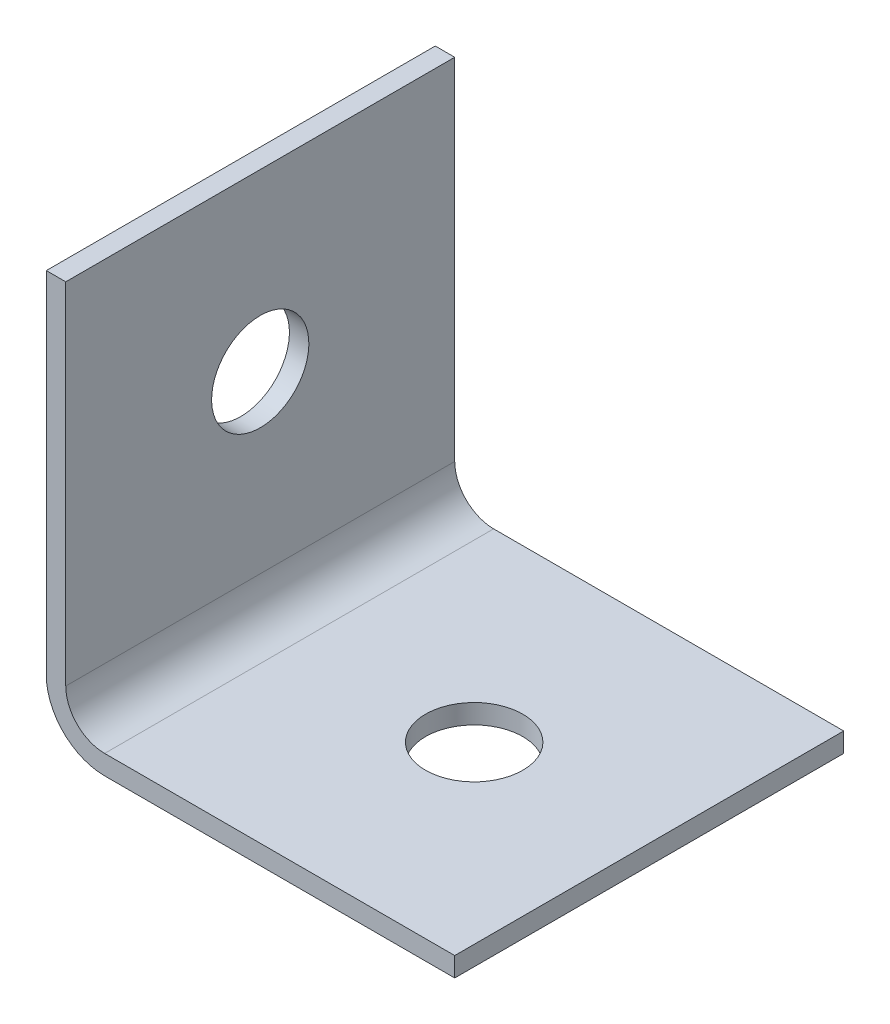
ISO-10303-21;
HEADER;
FILE_DESCRIPTION(('STEP AP214'),'2;1');
FILE_NAME('part.step','',(''),(''),'','','');
FILE_SCHEMA(('AUTOMOTIVE_DESIGN { 1 0 10303 214 1 1 1 1 }'));
ENDSEC;
DATA;
#1=APPLICATION_CONTEXT('core data for automotive mechanical design processes');
#2=APPLICATION_PROTOCOL_DEFINITION('international standard','automotive_design',2000,#1);
#3=PRODUCT_CONTEXT('',#1,'mechanical');
#4=PRODUCT('Part','Part','',(#3));
#5=PRODUCT_RELATED_PRODUCT_CATEGORY('part','',(#4));
#6=PRODUCT_DEFINITION_FORMATION('','',#4);
#7=PRODUCT_DEFINITION_CONTEXT('part definition',#1,'design');
#8=PRODUCT_DEFINITION('design','',#6,#7);
#9=PRODUCT_DEFINITION_SHAPE('','',#8);
#10=(LENGTH_UNIT() NAMED_UNIT(*) SI_UNIT(.MILLI.,.METRE.));
#11=(NAMED_UNIT(*) PLANE_ANGLE_UNIT() SI_UNIT($,.RADIAN.));
#12=(NAMED_UNIT(*) SI_UNIT($,.STERADIAN.) SOLID_ANGLE_UNIT());
#13=UNCERTAINTY_MEASURE_WITH_UNIT(LENGTH_MEASURE(1.E-05),#10,'distance_accuracy_value','');
#14=(GEOMETRIC_REPRESENTATION_CONTEXT(3) GLOBAL_UNCERTAINTY_ASSIGNED_CONTEXT((#13)) GLOBAL_UNIT_ASSIGNED_CONTEXT((#10,
#11,#12)) REPRESENTATION_CONTEXT('',''));
#15=CARTESIAN_POINT('',(0.,0.,0.));
#16=DIRECTION('',(0.,0.,1.));
#17=DIRECTION('',(1.,0.,0.));
#18=AXIS2_PLACEMENT_3D('',#15,#16,#17);
#19=CARTESIAN_POINT('',(0.,-21.,20.));
#20=DIRECTION('',(0.,1.,0.));
#21=DIRECTION('',(0.,0.,1.));
#22=AXIS2_PLACEMENT_3D('',#19,#20,#21);
#23=PLANE('',#22);
#24=CARTESIAN_POINT('',(11.,-21.,10.));
#25=DIRECTION('',(0.,1.,0.));
#26=DIRECTION('',(0.,0.,1.));
#27=AXIS2_PLACEMENT_3D('',#24,#25,#26);
#28=CIRCLE('',#27,2.5);
#29=CARTESIAN_POINT('',(11.,-21.,12.5));
#30=VERTEX_POINT('',#29);
#31=EDGE_CURVE('E223',#30,#30,#28,.T.);
#32=ORIENTED_EDGE('',*,*,#31,.T.);
#33=EDGE_LOOP('',(#32));
#34=FACE_BOUND('',#33,.T.);
#35=DIRECTION('',(1.,0.,0.));
#36=VECTOR('',#35,1.);
#37=CARTESIAN_POINT('',(0.,-21.,20.));
#38=LINE('',#37,#36);
#39=CARTESIAN_POINT('',(2.,-21.,20.));
#40=VERTEX_POINT('',#39);
#41=CARTESIAN_POINT('',(20.,-21.,20.));
#42=VERTEX_POINT('',#41);
#43=EDGE_CURVE('E97',#40,#42,#38,.T.);
#44=ORIENTED_EDGE('',*,*,#43,.F.);
#45=DIRECTION('',(0.,0.,-1.));
#46=VECTOR('',#45,1.);
#47=CARTESIAN_POINT('',(2.,-21.,20.));
#48=LINE('',#47,#46);
#49=CARTESIAN_POINT('',(2.,-21.,0.));
#50=VERTEX_POINT('',#49);
#51=EDGE_CURVE('E117',#40,#50,#48,.T.);
#52=ORIENTED_EDGE('',*,*,#51,.T.);
#53=DIRECTION('',(1.,0.,0.));
#54=VECTOR('',#53,1.);
#55=CARTESIAN_POINT('',(0.,-21.,0.));
#56=LINE('',#55,#54);
#57=CARTESIAN_POINT('',(20.,-21.,0.));
#58=VERTEX_POINT('',#57);
#59=EDGE_CURVE('E113',#50,#58,#56,.T.);
#60=ORIENTED_EDGE('',*,*,#59,.T.);
#61=DIRECTION('',(0.,0.,-1.));
#62=VECTOR('',#61,1.);
#63=CARTESIAN_POINT('',(20.,-21.,20.));
#64=LINE('',#63,#62);
#65=EDGE_CURVE('E111',#42,#58,#64,.T.);
#66=ORIENTED_EDGE('',*,*,#65,.F.);
#67=EDGE_LOOP('',(#44,#52,#60,#66));
#68=FACE_BOUND('',#67,.T.);
#69=ADVANCED_FACE('F33',(#34,#68),#23,.F.);
#70=CARTESIAN_POINT('',(20.,-20.,20.));
#71=DIRECTION('',(1.,0.,0.));
#72=DIRECTION('',(0.,0.,-1.));
#73=AXIS2_PLACEMENT_3D('',#70,#71,#72);
#74=PLANE('',#73);
#75=DIRECTION('',(0.,-1.,0.));
#76=VECTOR('',#75,1.);
#77=CARTESIAN_POINT('',(20.,-20.,0.));
#78=LINE('',#77,#76);
#79=CARTESIAN_POINT('',(20.,-20.,0.));
#80=VERTEX_POINT('',#79);
#81=EDGE_CURVE('E138',#80,#58,#78,.T.);
#82=ORIENTED_EDGE('',*,*,#81,.F.);
#83=DIRECTION('',(0.,0.,-1.));
#84=VECTOR('',#83,1.);
#85=CARTESIAN_POINT('',(20.,-20.,20.));
#86=LINE('',#85,#84);
#87=CARTESIAN_POINT('',(20.,-20.,20.));
#88=VERTEX_POINT('',#87);
#89=EDGE_CURVE('E118',#88,#80,#86,.T.);
#90=ORIENTED_EDGE('',*,*,#89,.F.);
#91=DIRECTION('',(0.,-1.,0.));
#92=VECTOR('',#91,1.);
#93=CARTESIAN_POINT('',(20.,-20.,20.));
#94=LINE('',#93,#92);
#95=EDGE_CURVE('E102',#88,#42,#94,.T.);
#96=ORIENTED_EDGE('',*,*,#95,.T.);
#97=ORIENTED_EDGE('',*,*,#65,.T.);
#98=EDGE_LOOP('',(#82,#90,#96,#97));
#99=FACE_BOUND('',#98,.T.);
#100=ADVANCED_FACE('F121',(#99),#74,.T.);
#101=CARTESIAN_POINT('',(0.,-20.,20.));
#102=DIRECTION('',(0.,1.,0.));
#103=DIRECTION('',(0.,0.,1.));
#104=AXIS2_PLACEMENT_3D('',#101,#102,#103);
#105=PLANE('',#104);
#106=CARTESIAN_POINT('',(11.,-20.,10.));
#107=DIRECTION('',(0.,1.,0.));
#108=DIRECTION('',(0.,0.,1.));
#109=AXIS2_PLACEMENT_3D('',#106,#107,#108);
#110=CIRCLE('',#109,2.5);
#111=CARTESIAN_POINT('',(11.,-20.,12.5));
#112=VERTEX_POINT('',#111);
#113=EDGE_CURVE('E221',#112,#112,#110,.T.);
#114=ORIENTED_EDGE('',*,*,#113,.F.);
#115=EDGE_LOOP('',(#114));
#116=FACE_BOUND('',#115,.T.);
#117=DIRECTION('',(1.,0.,0.));
#118=VECTOR('',#117,1.);
#119=CARTESIAN_POINT('',(0.,-20.,0.));
#120=LINE('',#119,#118);
#121=CARTESIAN_POINT('',(2.,-20.,0.));
#122=VERTEX_POINT('',#121);
#123=EDGE_CURVE('E140',#122,#80,#120,.T.);
#124=ORIENTED_EDGE('',*,*,#123,.F.);
#125=DIRECTION('',(0.,0.,-1.));
#126=VECTOR('',#125,1.);
#127=CARTESIAN_POINT('',(2.,-20.,20.));
#128=LINE('',#127,#126);
#129=CARTESIAN_POINT('',(2.,-20.,20.));
#130=VERTEX_POINT('',#129);
#131=EDGE_CURVE('E49',#122,#130,#128,.F.);
#132=ORIENTED_EDGE('',*,*,#131,.T.);
#133=DIRECTION('',(1.,0.,0.));
#134=VECTOR('',#133,1.);
#135=CARTESIAN_POINT('',(0.,-20.,20.));
#136=LINE('',#135,#134);
#137=EDGE_CURVE('E123',#130,#88,#136,.T.);
#138=ORIENTED_EDGE('',*,*,#137,.T.);
#139=ORIENTED_EDGE('',*,*,#89,.T.);
#140=EDGE_LOOP('',(#124,#132,#138,#139));
#141=FACE_BOUND('',#140,.T.);
#142=ADVANCED_FACE('F194',(#116,#141),#105,.T.);
#143=CARTESIAN_POINT('',(0.,0.,20.));
#144=DIRECTION('',(1.,0.,0.));
#145=DIRECTION('',(0.,1.,0.));
#146=AXIS2_PLACEMENT_3D('',#143,#144,#145);
#147=PLANE('',#146);
#148=CARTESIAN_POINT('',(0.,-9.,10.));
#149=DIRECTION('',(1.,0.,0.));
#150=DIRECTION('',(0.,1.,0.));
#151=AXIS2_PLACEMENT_3D('',#148,#149,#150);
#152=CIRCLE('',#151,2.5);
#153=CARTESIAN_POINT('',(0.,-6.5,10.));
#154=VERTEX_POINT('',#153);
#155=EDGE_CURVE('E224',#154,#154,#152,.T.);
#156=ORIENTED_EDGE('',*,*,#155,.F.);
#157=EDGE_LOOP('',(#156));
#158=FACE_BOUND('',#157,.T.);
#159=DIRECTION('',(0.,-1.,0.));
#160=VECTOR('',#159,1.);
#161=CARTESIAN_POINT('',(0.,0.,20.));
#162=LINE('',#161,#160);
#163=CARTESIAN_POINT('',(0.,0.,20.));
#164=VERTEX_POINT('',#163);
#165=CARTESIAN_POINT('',(0.,-18.,20.));
#166=VERTEX_POINT('',#165);
#167=EDGE_CURVE('E125',#164,#166,#162,.T.);
#168=ORIENTED_EDGE('',*,*,#167,.T.);
#169=DIRECTION('',(0.,0.,-1.));
#170=VECTOR('',#169,1.);
#171=CARTESIAN_POINT('',(0.,-18.,0.));
#172=LINE('',#171,#170);
#173=CARTESIAN_POINT('',(0.,-18.,0.));
#174=VERTEX_POINT('',#173);
#175=EDGE_CURVE('E159',#166,#174,#172,.T.);
#176=ORIENTED_EDGE('',*,*,#175,.T.);
#177=DIRECTION('',(0.,-1.,0.));
#178=VECTOR('',#177,1.);
#179=CARTESIAN_POINT('',(0.,0.,0.));
#180=LINE('',#179,#178);
#181=CARTESIAN_POINT('',(0.,0.,0.));
#182=VERTEX_POINT('',#181);
#183=EDGE_CURVE('E142',#182,#174,#180,.T.);
#184=ORIENTED_EDGE('',*,*,#183,.F.);
#185=DIRECTION('',(0.,0.,-1.));
#186=VECTOR('',#185,1.);
#187=CARTESIAN_POINT('',(0.,0.,20.));
#188=LINE('',#187,#186);
#189=EDGE_CURVE('E150',#164,#182,#188,.T.);
#190=ORIENTED_EDGE('',*,*,#189,.F.);
#191=EDGE_LOOP('',(#168,#176,#184,#190));
#192=FACE_BOUND('',#191,.T.);
#193=ADVANCED_FACE('F166',(#158,#192),#147,.T.);
#194=CARTESIAN_POINT('',(-1.,0.,20.));
#195=DIRECTION('',(0.,1.,0.));
#196=DIRECTION('',(-1.,0.,0.));
#197=AXIS2_PLACEMENT_3D('',#194,#195,#196);
#198=PLANE('',#197);
#199=DIRECTION('',(1.,0.,0.));
#200=VECTOR('',#199,1.);
#201=CARTESIAN_POINT('',(-1.,0.,0.));
#202=LINE('',#201,#200);
#203=CARTESIAN_POINT('',(-1.,0.,0.));
#204=VERTEX_POINT('',#203);
#205=EDGE_CURVE('E144',#204,#182,#202,.T.);
#206=ORIENTED_EDGE('',*,*,#205,.F.);
#207=DIRECTION('',(0.,0.,-1.));
#208=VECTOR('',#207,1.);
#209=CARTESIAN_POINT('',(-1.,0.,20.));
#210=LINE('',#209,#208);
#211=CARTESIAN_POINT('',(-1.,0.,20.));
#212=VERTEX_POINT('',#211);
#213=EDGE_CURVE('E136',#212,#204,#210,.T.);
#214=ORIENTED_EDGE('',*,*,#213,.F.);
#215=DIRECTION('',(1.,0.,0.));
#216=VECTOR('',#215,1.);
#217=CARTESIAN_POINT('',(-1.,0.,20.));
#218=LINE('',#217,#216);
#219=EDGE_CURVE('E131',#212,#164,#218,.T.);
#220=ORIENTED_EDGE('',*,*,#219,.T.);
#221=ORIENTED_EDGE('',*,*,#189,.T.);
#222=EDGE_LOOP('',(#206,#214,#220,#221));
#223=FACE_BOUND('',#222,.T.);
#224=ADVANCED_FACE('F174',(#223),#198,.T.);
#225=CARTESIAN_POINT('',(-1.,0.,20.));
#226=DIRECTION('',(1.,0.,0.));
#227=DIRECTION('',(0.,1.,0.));
#228=AXIS2_PLACEMENT_3D('',#225,#226,#227);
#229=PLANE('',#228);
#230=CARTESIAN_POINT('',(-0.999999999999999,-9.,10.));
#231=DIRECTION('',(1.,0.,0.));
#232=DIRECTION('',(0.,1.,0.));
#233=AXIS2_PLACEMENT_3D('',#230,#231,#232);
#234=CIRCLE('',#233,2.5);
#235=CARTESIAN_POINT('',(-0.999999999999999,-6.5,10.));
#236=VERTEX_POINT('',#235);
#237=EDGE_CURVE('E37',#236,#236,#234,.T.);
#238=ORIENTED_EDGE('',*,*,#237,.T.);
#239=EDGE_LOOP('',(#238));
#240=FACE_BOUND('',#239,.T.);
#241=DIRECTION('',(0.,-1.,0.));
#242=VECTOR('',#241,1.);
#243=CARTESIAN_POINT('',(-1.,0.,0.));
#244=LINE('',#243,#242);
#245=CARTESIAN_POINT('',(-0.999999999999998,-18.,0.));
#246=VERTEX_POINT('',#245);
#247=EDGE_CURVE('E108',#204,#246,#244,.T.);
#248=ORIENTED_EDGE('',*,*,#247,.T.);
#249=DIRECTION('',(0.,0.,-1.));
#250=VECTOR('',#249,1.);
#251=CARTESIAN_POINT('',(-0.999999999999998,-18.,20.));
#252=LINE('',#251,#250);
#253=CARTESIAN_POINT('',(-0.999999999999998,-18.,20.));
#254=VERTEX_POINT('',#253);
#255=EDGE_CURVE('E156',#246,#254,#252,.F.);
#256=ORIENTED_EDGE('',*,*,#255,.T.);
#257=DIRECTION('',(0.,-1.,0.));
#258=VECTOR('',#257,1.);
#259=CARTESIAN_POINT('',(-1.,0.,20.));
#260=LINE('',#259,#258);
#261=EDGE_CURVE('E134',#212,#254,#260,.T.);
#262=ORIENTED_EDGE('',*,*,#261,.F.);
#263=ORIENTED_EDGE('',*,*,#213,.T.);
#264=EDGE_LOOP('',(#248,#256,#262,#263));
#265=FACE_BOUND('',#264,.T.);
#266=ADVANCED_FACE('F206',(#240,#265),#229,.F.);
#267=CARTESIAN_POINT('',(0.,0.,20.));
#268=DIRECTION('',(0.,0.,-1.));
#269=DIRECTION('',(-1.,0.,0.));
#270=AXIS2_PLACEMENT_3D('',#267,#268,#269);
#271=PLANE('',#270);
#272=ORIENTED_EDGE('',*,*,#261,.T.);
#273=CARTESIAN_POINT('',(2.,-18.,20.));
#274=DIRECTION('',(0.,0.,-1.));
#275=DIRECTION('',(-1.,0.,0.));
#276=AXIS2_PLACEMENT_3D('',#273,#274,#275);
#277=CIRCLE('',#276,3.);
#278=EDGE_CURVE('E104',#254,#40,#277,.F.);
#279=ORIENTED_EDGE('',*,*,#278,.T.);
#280=ORIENTED_EDGE('',*,*,#43,.T.);
#281=ORIENTED_EDGE('',*,*,#95,.F.);
#282=ORIENTED_EDGE('',*,*,#137,.F.);
#283=CARTESIAN_POINT('',(2.,-18.,20.));
#284=DIRECTION('',(0.,0.,-1.));
#285=DIRECTION('',(-1.,0.,0.));
#286=AXIS2_PLACEMENT_3D('',#283,#284,#285);
#287=CIRCLE('',#286,2.);
#288=EDGE_CURVE('E11',#130,#166,#287,.T.);
#289=ORIENTED_EDGE('',*,*,#288,.T.);
#290=ORIENTED_EDGE('',*,*,#167,.F.);
#291=ORIENTED_EDGE('',*,*,#219,.F.);
#292=EDGE_LOOP('',(#272,#279,#280,#281,#282,#289,#290,#291));
#293=FACE_BOUND('',#292,.T.);
#294=ADVANCED_FACE('F100',(#293),#271,.F.);
#295=CARTESIAN_POINT('',(0.,0.,0.));
#296=DIRECTION('',(0.,0.,-1.));
#297=DIRECTION('',(-1.,0.,0.));
#298=AXIS2_PLACEMENT_3D('',#295,#296,#297);
#299=PLANE('',#298);
#300=ORIENTED_EDGE('',*,*,#59,.F.);
#301=CARTESIAN_POINT('',(2.,-18.,0.));
#302=DIRECTION('',(0.,0.,-1.));
#303=DIRECTION('',(-1.,0.,0.));
#304=AXIS2_PLACEMENT_3D('',#301,#302,#303);
#305=CIRCLE('',#304,3.);
#306=EDGE_CURVE('E154',#50,#246,#305,.T.);
#307=ORIENTED_EDGE('',*,*,#306,.T.);
#308=ORIENTED_EDGE('',*,*,#247,.F.);
#309=ORIENTED_EDGE('',*,*,#205,.T.);
#310=ORIENTED_EDGE('',*,*,#183,.T.);
#311=CARTESIAN_POINT('',(2.,-18.,0.));
#312=DIRECTION('',(0.,0.,-1.));
#313=DIRECTION('',(-1.,0.,0.));
#314=AXIS2_PLACEMENT_3D('',#311,#312,#313);
#315=CIRCLE('',#314,2.);
#316=EDGE_CURVE('E42',#174,#122,#315,.F.);
#317=ORIENTED_EDGE('',*,*,#316,.T.);
#318=ORIENTED_EDGE('',*,*,#123,.T.);
#319=ORIENTED_EDGE('',*,*,#81,.T.);
#320=EDGE_LOOP('',(#300,#307,#308,#309,#310,#317,#318,#319));
#321=FACE_BOUND('',#320,.T.);
#322=ADVANCED_FACE('F170',(#321),#299,.T.);
#323=CARTESIAN_POINT('',(2.,-18.,20.));
#324=DIRECTION('',(0.,0.,-1.));
#325=DIRECTION('',(-1.,0.,0.));
#326=AXIS2_PLACEMENT_3D('',#323,#324,#325);
#327=CYLINDRICAL_SURFACE('',#326,3.);
#328=ORIENTED_EDGE('',*,*,#278,.F.);
#329=ORIENTED_EDGE('',*,*,#255,.F.);
#330=ORIENTED_EDGE('',*,*,#306,.F.);
#331=ORIENTED_EDGE('',*,*,#51,.F.);
#332=EDGE_LOOP('',(#328,#329,#330,#331));
#333=FACE_BOUND('',#332,.T.);
#334=ADVANCED_FACE('F179',(#333),#327,.T.);
#335=CARTESIAN_POINT('',(2.,-18.,20.));
#336=DIRECTION('',(0.,0.,1.));
#337=DIRECTION('',(1.,0.,0.));
#338=AXIS2_PLACEMENT_3D('',#335,#336,#337);
#339=CYLINDRICAL_SURFACE('',#338,2.);
#340=ORIENTED_EDGE('',*,*,#288,.F.);
#341=ORIENTED_EDGE('',*,*,#131,.F.);
#342=ORIENTED_EDGE('',*,*,#316,.F.);
#343=ORIENTED_EDGE('',*,*,#175,.F.);
#344=EDGE_LOOP('',(#340,#341,#342,#343));
#345=FACE_BOUND('',#344,.T.);
#346=ADVANCED_FACE('F35',(#345),#339,.F.);
#347=CARTESIAN_POINT('',(-10.,-9.,10.));
#348=DIRECTION('',(1.,0.,0.));
#349=DIRECTION('',(0.,1.,0.));
#350=AXIS2_PLACEMENT_3D('',#347,#348,#349);
#351=CYLINDRICAL_SURFACE('',#350,2.5);
#352=ORIENTED_EDGE('',*,*,#155,.T.);
#353=EDGE_LOOP('',(#352));
#354=FACE_BOUND('',#353,.T.);
#355=ORIENTED_EDGE('',*,*,#237,.F.);
#356=EDGE_LOOP('',(#355));
#357=FACE_BOUND('',#356,.T.);
#358=ADVANCED_FACE('F178',(#354,#357),#351,.F.);
#359=CARTESIAN_POINT('',(11.,-30.,10.));
#360=DIRECTION('',(0.,1.,0.));
#361=DIRECTION('',(0.,0.,1.));
#362=AXIS2_PLACEMENT_3D('',#359,#360,#361);
#363=CYLINDRICAL_SURFACE('',#362,2.5);
#364=ORIENTED_EDGE('',*,*,#113,.T.);
#365=EDGE_LOOP('',(#364));
#366=FACE_BOUND('',#365,.T.);
#367=ORIENTED_EDGE('',*,*,#31,.F.);
#368=EDGE_LOOP('',(#367));
#369=FACE_BOUND('',#368,.T.);
#370=ADVANCED_FACE('F184',(#366,#369),#363,.F.);
#371=CLOSED_SHELL('',(#69,#100,#142,#193,#224,#266,#294,#322,#334,#346,#358,#370));
#372=MANIFOLD_SOLID_BREP('B2',#371);
#373=ADVANCED_BREP_SHAPE_REPRESENTATION('',(#18,#372),#14);
#374=SHAPE_DEFINITION_REPRESENTATION(#9,#373);
ENDSEC;
END-ISO-10303-21;
